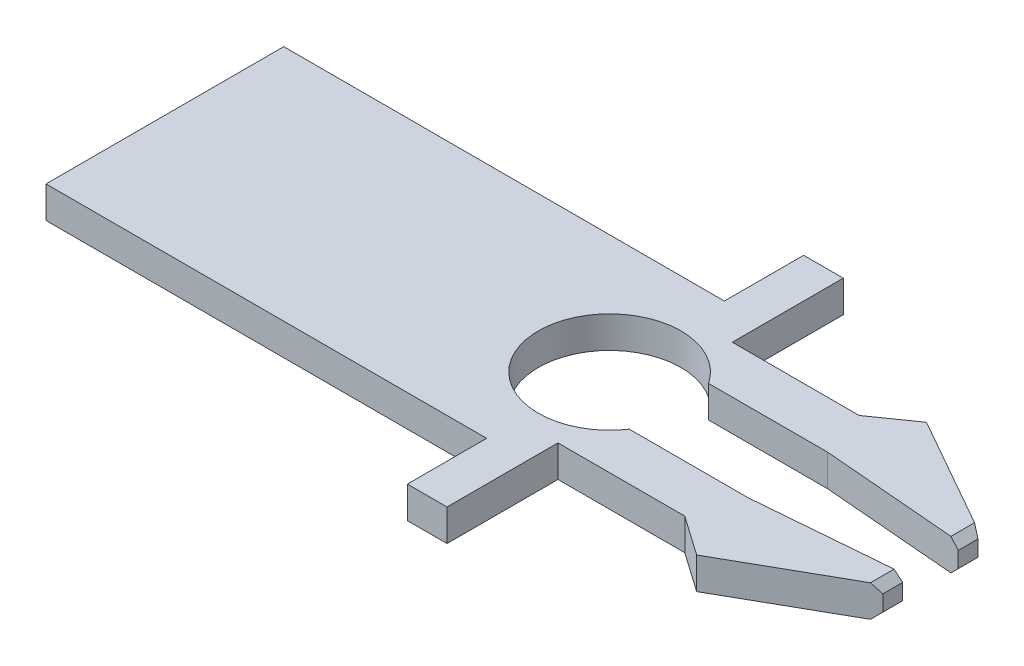
ISO-10303-21;
HEADER;
FILE_DESCRIPTION(('STEP AP214'),'2;1');
FILE_NAME('part.step','',(''),(''),'','','');
FILE_SCHEMA(('AUTOMOTIVE_DESIGN { 1 0 10303 214 1 1 1 1 }'));
ENDSEC;
DATA;
#1=APPLICATION_CONTEXT('core data for automotive mechanical design processes');
#2=APPLICATION_PROTOCOL_DEFINITION('international standard','automotive_design',2000,#1);
#3=PRODUCT_CONTEXT('',#1,'mechanical');
#4=PRODUCT('Part','Part','',(#3));
#5=PRODUCT_RELATED_PRODUCT_CATEGORY('part','',(#4));
#6=PRODUCT_DEFINITION_FORMATION('','',#4);
#7=PRODUCT_DEFINITION_CONTEXT('part definition',#1,'design');
#8=PRODUCT_DEFINITION('design','',#6,#7);
#9=PRODUCT_DEFINITION_SHAPE('','',#8);
#10=(LENGTH_UNIT() NAMED_UNIT(*) SI_UNIT(.MILLI.,.METRE.));
#11=(NAMED_UNIT(*) PLANE_ANGLE_UNIT() SI_UNIT($,.RADIAN.));
#12=(NAMED_UNIT(*) SI_UNIT($,.STERADIAN.) SOLID_ANGLE_UNIT());
#13=UNCERTAINTY_MEASURE_WITH_UNIT(LENGTH_MEASURE(1.E-05),#10,'distance_accuracy_value','');
#14=(GEOMETRIC_REPRESENTATION_CONTEXT(3) GLOBAL_UNCERTAINTY_ASSIGNED_CONTEXT((#13)) GLOBAL_UNIT_ASSIGNED_CONTEXT((#10,
#11,#12)) REPRESENTATION_CONTEXT('',''));
#15=CARTESIAN_POINT('',(0.,0.,0.));
#16=DIRECTION('',(0.,0.,1.));
#17=DIRECTION('',(1.,0.,0.));
#18=AXIS2_PLACEMENT_3D('',#15,#16,#17);
#19=CARTESIAN_POINT('',(7.03,18.74,0.95));
#20=DIRECTION('',(-0.707106781186547,-0.707106781186548,0.));
#21=DIRECTION('',(0.,0.,-1.));
#22=AXIS2_PLACEMENT_3D('',#19,#20,#21);
#23=PLANE('',#22);
#24=DIRECTION('',(0.705882352941177,-0.705882352941176,-0.0588235294117651));
#25=VECTOR('',#24,1.);
#26=CARTESIAN_POINT('',(6.98017301038062,18.7898269896194,0.704152249134948));
#27=LINE('',#26,#25);
#28=CARTESIAN_POINT('',(6.93,18.84,0.708333333333333));
#29=VERTEX_POINT('',#28);
#30=CARTESIAN_POINT('',(7.03,18.74,0.7));
#31=VERTEX_POINT('',#30);
#32=EDGE_CURVE('E407',#29,#31,#27,.T.);
#33=ORIENTED_EDGE('',*,*,#32,.F.);
#34=DIRECTION('',(0.,0.,-1.));
#35=VECTOR('',#34,1.);
#36=CARTESIAN_POINT('',(6.93,18.84,0.35));
#37=LINE('',#36,#35);
#38=CARTESIAN_POINT('',(6.93,18.84,1.00666666666667));
#39=VERTEX_POINT('',#38);
#40=EDGE_CURVE('E419',#39,#29,#37,.T.);
#41=ORIENTED_EDGE('',*,*,#40,.F.);
#42=DIRECTION('',(-0.656375005190605,0.656375005190604,0.371945836274676));
#43=VECTOR('',#42,1.);
#44=CARTESIAN_POINT('',(6.13315940641455,19.6368405935855,1.45820966969842));
#45=LINE('',#44,#43);
#46=CARTESIAN_POINT('',(7.03,18.74,0.95));
#47=VERTEX_POINT('',#46);
#48=EDGE_CURVE('E320',#47,#39,#45,.T.);
#49=ORIENTED_EDGE('',*,*,#48,.F.);
#50=DIRECTION('',(0.,0.,1.));
#51=VECTOR('',#50,1.);
#52=CARTESIAN_POINT('',(7.03,18.74,0.95));
#53=LINE('',#52,#51);
#54=EDGE_CURVE('E310',#31,#47,#53,.T.);
#55=ORIENTED_EDGE('',*,*,#54,.F.);
#56=EDGE_LOOP('',(#33,#41,#49,#55));
#57=FACE_BOUND('',#56,.T.);
#58=ADVANCED_FACE('F16',(#57),#23,.F.);
#59=CARTESIAN_POINT('',(7.03,18.74,-0.25));
#60=DIRECTION('',(-0.707106781186547,-0.707106781186548,0.));
#61=DIRECTION('',(0.,0.,-1.));
#62=AXIS2_PLACEMENT_3D('',#59,#60,#61);
#63=PLANE('',#62);
#64=DIRECTION('',(0.656375005190605,-0.656375005190604,0.371945836274676));
#65=VECTOR('',#64,1.);
#66=CARTESIAN_POINT('',(6.13315940641455,19.6368405935855,-0.75820966969842));
#67=LINE('',#66,#65);
#68=CARTESIAN_POINT('',(6.93,18.84,-0.306666666666666));
#69=VERTEX_POINT('',#68);
#70=CARTESIAN_POINT('',(7.03,18.74,-0.25));
#71=VERTEX_POINT('',#70);
#72=EDGE_CURVE('E242',#69,#71,#67,.T.);
#73=ORIENTED_EDGE('',*,*,#72,.F.);
#74=DIRECTION('',(0.,0.,-1.));
#75=VECTOR('',#74,1.);
#76=CARTESIAN_POINT('',(6.93,18.84,0.35));
#77=LINE('',#76,#75);
#78=CARTESIAN_POINT('',(6.93,18.84,-0.00833333333333303));
#79=VERTEX_POINT('',#78);
#80=EDGE_CURVE('E308',#79,#69,#77,.T.);
#81=ORIENTED_EDGE('',*,*,#80,.F.);
#82=DIRECTION('',(-0.705882352941177,0.705882352941176,-0.0588235294117651));
#83=VECTOR('',#82,1.);
#84=CARTESIAN_POINT('',(6.98017301038062,18.7898269896194,-0.00415224913494805));
#85=LINE('',#84,#83);
#86=CARTESIAN_POINT('',(7.03,18.74,0.));
#87=VERTEX_POINT('',#86);
#88=EDGE_CURVE('E245',#87,#79,#85,.T.);
#89=ORIENTED_EDGE('',*,*,#88,.F.);
#90=DIRECTION('',(0.,0.,1.));
#91=VECTOR('',#90,1.);
#92=CARTESIAN_POINT('',(7.03,18.74,-0.25));
#93=LINE('',#92,#91);
#94=EDGE_CURVE('E238',#71,#87,#93,.T.);
#95=ORIENTED_EDGE('',*,*,#94,.F.);
#96=EDGE_LOOP('',(#73,#81,#89,#95));
#97=FACE_BOUND('',#96,.T.);
#98=ADVANCED_FACE('F240',(#97),#63,.F.);
#99=CARTESIAN_POINT('',(6.93,18.44,0.35));
#100=DIRECTION('',(0.707106781186547,-0.707106781186548,0.));
#101=DIRECTION('',(0.,0.,-1.));
#102=AXIS2_PLACEMENT_3D('',#99,#100,#101);
#103=PLANE('',#102);
#104=DIRECTION('',(-0.705882352941177,-0.705882352941176,0.0588235294117651));
#105=VECTOR('',#104,1.);
#106=CARTESIAN_POINT('',(7.17948096885813,18.6894809688582,0.687543252595155));
#107=LINE('',#106,#105);
#108=CARTESIAN_POINT('',(7.03,18.54,0.7));
#109=VERTEX_POINT('',#108);
#110=CARTESIAN_POINT('',(6.93,18.44,0.708333333333333));
#111=VERTEX_POINT('',#110);
#112=EDGE_CURVE('E294',#109,#111,#107,.T.);
#113=ORIENTED_EDGE('',*,*,#112,.F.);
#114=DIRECTION('',(0.,0.,-1.));
#115=VECTOR('',#114,1.);
#116=CARTESIAN_POINT('',(7.03,18.54,0.7));
#117=LINE('',#116,#115);
#118=CARTESIAN_POINT('',(7.03,18.54,0.95));
#119=VERTEX_POINT('',#118);
#120=EDGE_CURVE('E315',#119,#109,#117,.T.);
#121=ORIENTED_EDGE('',*,*,#120,.F.);
#122=DIRECTION('',(0.656375005190605,0.656375005190604,-0.371945836274676));
#123=VECTOR('',#122,1.);
#124=CARTESIAN_POINT('',(6.30549066539014,17.8154906653902,1.36055528961226));
#125=LINE('',#124,#123);
#126=CARTESIAN_POINT('',(6.93,18.44,1.00666666666667));
#127=VERTEX_POINT('',#126);
#128=EDGE_CURVE('E331',#127,#119,#125,.T.);
#129=ORIENTED_EDGE('',*,*,#128,.F.);
#130=DIRECTION('',(0.,0.,1.));
#131=VECTOR('',#130,1.);
#132=CARTESIAN_POINT('',(6.93,18.44,0.95));
#133=LINE('',#132,#131);
#134=EDGE_CURVE('E11',#111,#127,#133,.T.);
#135=ORIENTED_EDGE('',*,*,#134,.F.);
#136=EDGE_LOOP('',(#113,#121,#129,#135));
#137=FACE_BOUND('',#136,.T.);
#138=ADVANCED_FACE('F574',(#137),#103,.T.);
#139=CARTESIAN_POINT('',(6.93,18.44,0.35));
#140=DIRECTION('',(0.707106781186547,-0.707106781186548,0.));
#141=DIRECTION('',(0.,0.,-1.));
#142=AXIS2_PLACEMENT_3D('',#139,#140,#141);
#143=PLANE('',#142);
#144=DIRECTION('',(-0.656375005190605,-0.656375005190604,-0.371945836274676));
#145=VECTOR('',#144,1.);
#146=CARTESIAN_POINT('',(6.30549066539014,17.8154906653902,-0.66055528961226));
#147=LINE('',#146,#145);
#148=CARTESIAN_POINT('',(7.03,18.54,-0.25));
#149=VERTEX_POINT('',#148);
#150=CARTESIAN_POINT('',(6.93,18.44,-0.306666666666666));
#151=VERTEX_POINT('',#150);
#152=EDGE_CURVE('E268',#149,#151,#147,.T.);
#153=ORIENTED_EDGE('',*,*,#152,.F.);
#154=DIRECTION('',(0.,0.,-1.));
#155=VECTOR('',#154,1.);
#156=CARTESIAN_POINT('',(7.03,18.54,-0.25));
#157=LINE('',#156,#155);
#158=CARTESIAN_POINT('',(7.03,18.54,0.));
#159=VERTEX_POINT('',#158);
#160=EDGE_CURVE('E252',#159,#149,#157,.T.);
#161=ORIENTED_EDGE('',*,*,#160,.F.);
#162=DIRECTION('',(0.705882352941177,0.705882352941176,0.0588235294117651));
#163=VECTOR('',#162,1.);
#164=CARTESIAN_POINT('',(7.17948096885813,18.6894809688582,0.012456747404845));
#165=LINE('',#164,#163);
#166=CARTESIAN_POINT('',(6.93,18.44,-0.00833333333333303));
#167=VERTEX_POINT('',#166);
#168=EDGE_CURVE('E350',#167,#159,#165,.T.);
#169=ORIENTED_EDGE('',*,*,#168,.F.);
#170=DIRECTION('',(0.,0.,1.));
#171=VECTOR('',#170,1.);
#172=CARTESIAN_POINT('',(6.93,18.44,0.));
#173=LINE('',#172,#171);
#174=EDGE_CURVE('E27',#151,#167,#173,.T.);
#175=ORIENTED_EDGE('',*,*,#174,.F.);
#176=EDGE_LOOP('',(#153,#161,#169,#175));
#177=FACE_BOUND('',#176,.T.);
#178=ADVANCED_FACE('F621',(#177),#143,.T.);
#179=CARTESIAN_POINT('',(2.98166852264522,18.44,0.35));
#180=DIRECTION('',(0.,1.,0.));
#181=DIRECTION('',(-1.,0.,0.));
#182=AXIS2_PLACEMENT_3D('',#179,#180,#181);
#183=PLANE('',#182);
#184=DIRECTION('',(0.870022185848613,0.,0.49301257198088));
#185=VECTOR('',#184,1.);
#186=CARTESIAN_POINT('',(5.53,18.44,-1.1));
#187=LINE('',#186,#185);
#188=CARTESIAN_POINT('',(5.53,18.44,-1.1));
#189=VERTEX_POINT('',#188);
#190=EDGE_CURVE('E275',#189,#151,#187,.T.);
#191=ORIENTED_EDGE('',*,*,#190,.T.);
#192=ORIENTED_EDGE('',*,*,#174,.T.);
#193=DIRECTION('',(-0.99654575824488,0.,-0.0830454798537404));
#194=VECTOR('',#193,1.);
#195=CARTESIAN_POINT('',(7.03,18.44,0.));
#196=LINE('',#195,#194);
#197=CARTESIAN_POINT('',(5.23,18.44,-0.15));
#198=VERTEX_POINT('',#197);
#199=EDGE_CURVE('E251',#167,#198,#196,.T.);
#200=ORIENTED_EDGE('',*,*,#199,.T.);
#201=DIRECTION('',(-1.,0.,0.));
#202=VECTOR('',#201,1.);
#203=CARTESIAN_POINT('',(5.23,18.44,-0.15));
#204=LINE('',#203,#202);
#205=CARTESIAN_POINT('',(3.73,18.44,-0.15));
#206=VERTEX_POINT('',#205);
#207=EDGE_CURVE('E287',#198,#206,#204,.T.);
#208=ORIENTED_EDGE('',*,*,#207,.T.);
#209=CARTESIAN_POINT('',(2.98166852264522,18.44,0.35));
#210=DIRECTION('',(0.,1.,0.));
#211=DIRECTION('',(1.,0.,0.));
#212=AXIS2_PLACEMENT_3D('',#209,#210,#211);
#213=CIRCLE('',#212,0.9);
#214=CARTESIAN_POINT('',(3.73,18.44,0.85));
#215=VERTEX_POINT('',#214);
#216=EDGE_CURVE('E283',#206,#215,#213,.T.);
#217=ORIENTED_EDGE('',*,*,#216,.T.);
#218=DIRECTION('',(1.,0.,0.));
#219=VECTOR('',#218,1.);
#220=CARTESIAN_POINT('',(5.23,18.44,0.85));
#221=LINE('',#220,#219);
#222=CARTESIAN_POINT('',(5.23,18.44,0.85));
#223=VERTEX_POINT('',#222);
#224=EDGE_CURVE('E344',#215,#223,#221,.T.);
#225=ORIENTED_EDGE('',*,*,#224,.T.);
#226=DIRECTION('',(0.99654575824488,0.,-0.0830454798537404));
#227=VECTOR('',#226,1.);
#228=CARTESIAN_POINT('',(7.03,18.44,0.7));
#229=LINE('',#228,#227);
#230=EDGE_CURVE('E289',#223,#111,#229,.T.);
#231=ORIENTED_EDGE('',*,*,#230,.T.);
#232=ORIENTED_EDGE('',*,*,#134,.T.);
#233=DIRECTION('',(-0.870022185848613,0.,0.49301257198088));
#234=VECTOR('',#233,1.);
#235=CARTESIAN_POINT('',(5.53,18.44,1.8));
#236=LINE('',#235,#234);
#237=CARTESIAN_POINT('',(5.53,18.44,1.8));
#238=VERTEX_POINT('',#237);
#239=EDGE_CURVE('E314',#127,#238,#236,.T.);
#240=ORIENTED_EDGE('',*,*,#239,.T.);
#241=DIRECTION('',(-0.81923192051904,0.,-0.573462344363329));
#242=VECTOR('',#241,1.);
#243=CARTESIAN_POINT('',(5.03,18.44,1.45));
#244=LINE('',#243,#242);
#245=CARTESIAN_POINT('',(5.03,18.44,1.45));
#246=VERTEX_POINT('',#245);
#247=EDGE_CURVE('E326',#238,#246,#244,.T.);
#248=ORIENTED_EDGE('',*,*,#247,.T.);
#249=DIRECTION('',(-1.,0.,0.));
#250=VECTOR('',#249,1.);
#251=CARTESIAN_POINT('',(3.43,18.44,1.45));
#252=LINE('',#251,#250);
#253=CARTESIAN_POINT('',(3.43,18.44,1.45));
#254=VERTEX_POINT('',#253);
#255=EDGE_CURVE('E379',#246,#254,#252,.T.);
#256=ORIENTED_EDGE('',*,*,#255,.T.);
#257=DIRECTION('',(0.,0.,1.));
#258=VECTOR('',#257,1.);
#259=CARTESIAN_POINT('',(3.43,18.44,2.85));
#260=LINE('',#259,#258);
#261=CARTESIAN_POINT('',(3.43,18.44,2.85));
#262=VERTEX_POINT('',#261);
#263=EDGE_CURVE('E300',#254,#262,#260,.T.);
#264=ORIENTED_EDGE('',*,*,#263,.T.);
#265=DIRECTION('',(-1.,0.,0.));
#266=VECTOR('',#265,1.);
#267=CARTESIAN_POINT('',(2.93,18.44,2.85));
#268=LINE('',#267,#266);
#269=CARTESIAN_POINT('',(2.93,18.44,2.85));
#270=VERTEX_POINT('',#269);
#271=EDGE_CURVE('E366',#262,#270,#268,.T.);
#272=ORIENTED_EDGE('',*,*,#271,.T.);
#273=DIRECTION('',(0.,0.,-1.));
#274=VECTOR('',#273,1.);
#275=CARTESIAN_POINT('',(2.93,18.44,1.85));
#276=LINE('',#275,#274);
#277=CARTESIAN_POINT('',(2.93,18.44,1.85));
#278=VERTEX_POINT('',#277);
#279=EDGE_CURVE('E467',#270,#278,#276,.T.);
#280=ORIENTED_EDGE('',*,*,#279,.T.);
#281=DIRECTION('',(-1.,0.,0.));
#282=VECTOR('',#281,1.);
#283=CARTESIAN_POINT('',(-2.63,18.44,1.85));
#284=LINE('',#283,#282);
#285=CARTESIAN_POINT('',(-2.63,18.44,1.85));
#286=VERTEX_POINT('',#285);
#287=EDGE_CURVE('E309',#278,#286,#284,.T.);
#288=ORIENTED_EDGE('',*,*,#287,.T.);
#289=DIRECTION('',(0.,0.,-1.));
#290=VECTOR('',#289,1.);
#291=CARTESIAN_POINT('',(-2.63,18.44,-1.15));
#292=LINE('',#291,#290);
#293=CARTESIAN_POINT('',(-2.63,18.44,-1.15));
#294=VERTEX_POINT('',#293);
#295=EDGE_CURVE('E352',#286,#294,#292,.T.);
#296=ORIENTED_EDGE('',*,*,#295,.T.);
#297=DIRECTION('',(1.,0.,0.));
#298=VECTOR('',#297,1.);
#299=CARTESIAN_POINT('',(-2.63,18.44,-1.15));
#300=LINE('',#299,#298);
#301=CARTESIAN_POINT('',(2.93,18.44,-1.15));
#302=VERTEX_POINT('',#301);
#303=EDGE_CURVE('E495',#294,#302,#300,.T.);
#304=ORIENTED_EDGE('',*,*,#303,.T.);
#305=DIRECTION('',(0.,0.,-1.));
#306=VECTOR('',#305,1.);
#307=CARTESIAN_POINT('',(2.93,18.44,-1.15));
#308=LINE('',#307,#306);
#309=CARTESIAN_POINT('',(2.93,18.44,-2.15));
#310=VERTEX_POINT('',#309);
#311=EDGE_CURVE('E389',#302,#310,#308,.T.);
#312=ORIENTED_EDGE('',*,*,#311,.T.);
#313=DIRECTION('',(1.,0.,0.));
#314=VECTOR('',#313,1.);
#315=CARTESIAN_POINT('',(2.93,18.44,-2.15));
#316=LINE('',#315,#314);
#317=CARTESIAN_POINT('',(3.43,18.44,-2.15));
#318=VERTEX_POINT('',#317);
#319=EDGE_CURVE('E399',#310,#318,#316,.T.);
#320=ORIENTED_EDGE('',*,*,#319,.T.);
#321=DIRECTION('',(0.,0.,1.));
#322=VECTOR('',#321,1.);
#323=CARTESIAN_POINT('',(3.43,18.44,-2.15));
#324=LINE('',#323,#322);
#325=CARTESIAN_POINT('',(3.43,18.44,-0.75));
#326=VERTEX_POINT('',#325);
#327=EDGE_CURVE('E423',#318,#326,#324,.T.);
#328=ORIENTED_EDGE('',*,*,#327,.T.);
#329=DIRECTION('',(1.,0.,0.));
#330=VECTOR('',#329,1.);
#331=CARTESIAN_POINT('',(3.43,18.44,-0.75));
#332=LINE('',#331,#330);
#333=CARTESIAN_POINT('',(5.03,18.44,-0.75));
#334=VERTEX_POINT('',#333);
#335=EDGE_CURVE('E371',#326,#334,#332,.T.);
#336=ORIENTED_EDGE('',*,*,#335,.T.);
#337=DIRECTION('',(0.81923192051904,0.,-0.573462344363329));
#338=VECTOR('',#337,1.);
#339=CARTESIAN_POINT('',(5.03,18.44,-0.75));
#340=LINE('',#339,#338);
#341=EDGE_CURVE('E295',#334,#189,#340,.T.);
#342=ORIENTED_EDGE('',*,*,#341,.T.);
#343=EDGE_LOOP('',(#191,#192,#200,#208,#217,#225,#231,#232,#240,#248,#256,#264,#272,#280,#288,
#296,#304,#312,#320,#328,#336,#342));
#344=FACE_BOUND('',#343,.T.);
#345=ADVANCED_FACE('F548',(#344),#183,.F.);
#346=CARTESIAN_POINT('',(2.98166852264522,18.84,0.35));
#347=DIRECTION('',(0.,1.,0.));
#348=DIRECTION('',(-1.,0.,0.));
#349=AXIS2_PLACEMENT_3D('',#346,#347,#348);
#350=PLANE('',#349);
#351=DIRECTION('',(-0.99654575824488,0.,-0.0830454798537404));
#352=VECTOR('',#351,1.);
#353=CARTESIAN_POINT('',(7.03,18.84,0.));
#354=LINE('',#353,#352);
#355=CARTESIAN_POINT('',(5.23,18.84,-0.15));
#356=VERTEX_POINT('',#355);
#357=EDGE_CURVE('E288',#79,#356,#354,.T.);
#358=ORIENTED_EDGE('',*,*,#357,.F.);
#359=ORIENTED_EDGE('',*,*,#80,.T.);
#360=DIRECTION('',(0.870022185848613,0.,0.49301257198088));
#361=VECTOR('',#360,1.);
#362=CARTESIAN_POINT('',(5.53,18.84,-1.1));
#363=LINE('',#362,#361);
#364=CARTESIAN_POINT('',(5.53,18.84,-1.1));
#365=VERTEX_POINT('',#364);
#366=EDGE_CURVE('E260',#365,#69,#363,.T.);
#367=ORIENTED_EDGE('',*,*,#366,.F.);
#368=DIRECTION('',(0.81923192051904,0.,-0.573462344363329));
#369=VECTOR('',#368,1.);
#370=CARTESIAN_POINT('',(5.03,18.84,-0.75));
#371=LINE('',#370,#369);
#372=CARTESIAN_POINT('',(5.03,18.84,-0.75));
#373=VERTEX_POINT('',#372);
#374=EDGE_CURVE('E279',#373,#365,#371,.T.);
#375=ORIENTED_EDGE('',*,*,#374,.F.);
#376=DIRECTION('',(1.,0.,0.));
#377=VECTOR('',#376,1.);
#378=CARTESIAN_POINT('',(3.43,18.84,-0.75));
#379=LINE('',#378,#377);
#380=CARTESIAN_POINT('',(3.43,18.84,-0.75));
#381=VERTEX_POINT('',#380);
#382=EDGE_CURVE('E330',#381,#373,#379,.T.);
#383=ORIENTED_EDGE('',*,*,#382,.F.);
#384=DIRECTION('',(0.,0.,1.));
#385=VECTOR('',#384,1.);
#386=CARTESIAN_POINT('',(3.43,18.84,-2.15));
#387=LINE('',#386,#385);
#388=CARTESIAN_POINT('',(3.43,18.84,-2.15));
#389=VERTEX_POINT('',#388);
#390=EDGE_CURVE('E372',#389,#381,#387,.T.);
#391=ORIENTED_EDGE('',*,*,#390,.F.);
#392=DIRECTION('',(1.,0.,0.));
#393=VECTOR('',#392,1.);
#394=CARTESIAN_POINT('',(2.93,18.84,-2.15));
#395=LINE('',#394,#393);
#396=CARTESIAN_POINT('',(2.93,18.84,-2.15));
#397=VERTEX_POINT('',#396);
#398=EDGE_CURVE('E408',#397,#389,#395,.T.);
#399=ORIENTED_EDGE('',*,*,#398,.F.);
#400=DIRECTION('',(0.,0.,-1.));
#401=VECTOR('',#400,1.);
#402=CARTESIAN_POINT('',(2.93,18.84,-1.15));
#403=LINE('',#402,#401);
#404=CARTESIAN_POINT('',(2.93,18.84,-1.15));
#405=VERTEX_POINT('',#404);
#406=EDGE_CURVE('E393',#405,#397,#403,.T.);
#407=ORIENTED_EDGE('',*,*,#406,.F.);
#408=DIRECTION('',(1.,0.,0.));
#409=VECTOR('',#408,1.);
#410=CARTESIAN_POINT('',(-2.63,18.84,-1.15));
#411=LINE('',#410,#409);
#412=CARTESIAN_POINT('',(-2.63,18.84,-1.15));
#413=VERTEX_POINT('',#412);
#414=EDGE_CURVE('E506',#413,#405,#411,.T.);
#415=ORIENTED_EDGE('',*,*,#414,.F.);
#416=DIRECTION('',(0.,0.,-1.));
#417=VECTOR('',#416,1.);
#418=CARTESIAN_POINT('',(-2.63,18.84,-1.15));
#419=LINE('',#418,#417);
#420=CARTESIAN_POINT('',(-2.63,18.84,1.85));
#421=VERTEX_POINT('',#420);
#422=EDGE_CURVE('E428',#421,#413,#419,.T.);
#423=ORIENTED_EDGE('',*,*,#422,.F.);
#424=DIRECTION('',(-1.,0.,0.));
#425=VECTOR('',#424,1.);
#426=CARTESIAN_POINT('',(-2.63,18.84,1.85));
#427=LINE('',#426,#425);
#428=CARTESIAN_POINT('',(2.93,18.84,1.85));
#429=VERTEX_POINT('',#428);
#430=EDGE_CURVE('E41',#429,#421,#427,.T.);
#431=ORIENTED_EDGE('',*,*,#430,.F.);
#432=DIRECTION('',(0.,0.,-1.));
#433=VECTOR('',#432,1.);
#434=CARTESIAN_POINT('',(2.93,18.84,1.85));
#435=LINE('',#434,#433);
#436=CARTESIAN_POINT('',(2.93,18.84,2.85));
#437=VERTEX_POINT('',#436);
#438=EDGE_CURVE('E471',#437,#429,#435,.T.);
#439=ORIENTED_EDGE('',*,*,#438,.F.);
#440=DIRECTION('',(-1.,0.,0.));
#441=VECTOR('',#440,1.);
#442=CARTESIAN_POINT('',(2.93,18.84,2.85));
#443=LINE('',#442,#441);
#444=CARTESIAN_POINT('',(3.43,18.84,2.85));
#445=VERTEX_POINT('',#444);
#446=EDGE_CURVE('E361',#445,#437,#443,.T.);
#447=ORIENTED_EDGE('',*,*,#446,.F.);
#448=DIRECTION('',(0.,0.,1.));
#449=VECTOR('',#448,1.);
#450=CARTESIAN_POINT('',(3.43,18.84,2.85));
#451=LINE('',#450,#449);
#452=CARTESIAN_POINT('',(3.43,18.84,1.45));
#453=VERTEX_POINT('',#452);
#454=EDGE_CURVE('E304',#453,#445,#451,.T.);
#455=ORIENTED_EDGE('',*,*,#454,.F.);
#456=DIRECTION('',(-1.,0.,0.));
#457=VECTOR('',#456,1.);
#458=CARTESIAN_POINT('',(3.43,18.84,1.45));
#459=LINE('',#458,#457);
#460=CARTESIAN_POINT('',(5.03,18.84,1.45));
#461=VERTEX_POINT('',#460);
#462=EDGE_CURVE('E416',#461,#453,#459,.T.);
#463=ORIENTED_EDGE('',*,*,#462,.F.);
#464=DIRECTION('',(-0.81923192051904,0.,-0.573462344363329));
#465=VECTOR('',#464,1.);
#466=CARTESIAN_POINT('',(5.03,18.84,1.45));
#467=LINE('',#466,#465);
#468=CARTESIAN_POINT('',(5.53,18.84,1.8));
#469=VERTEX_POINT('',#468);
#470=EDGE_CURVE('E321',#469,#461,#467,.T.);
#471=ORIENTED_EDGE('',*,*,#470,.F.);
#472=DIRECTION('',(-0.870022185848613,0.,0.49301257198088));
#473=VECTOR('',#472,1.);
#474=CARTESIAN_POINT('',(5.53,18.84,1.8));
#475=LINE('',#474,#473);
#476=EDGE_CURVE('E316',#39,#469,#475,.T.);
#477=ORIENTED_EDGE('',*,*,#476,.F.);
#478=ORIENTED_EDGE('',*,*,#40,.T.);
#479=DIRECTION('',(0.99654575824488,0.,-0.0830454798537404));
#480=VECTOR('',#479,1.);
#481=CARTESIAN_POINT('',(7.03,18.84,0.7));
#482=LINE('',#481,#480);
#483=CARTESIAN_POINT('',(5.23,18.84,0.85));
#484=VERTEX_POINT('',#483);
#485=EDGE_CURVE('E293',#484,#29,#482,.T.);
#486=ORIENTED_EDGE('',*,*,#485,.F.);
#487=DIRECTION('',(1.,0.,0.));
#488=VECTOR('',#487,1.);
#489=CARTESIAN_POINT('',(5.23,18.84,0.85));
#490=LINE('',#489,#488);
#491=CARTESIAN_POINT('',(3.73,18.84,0.85));
#492=VERTEX_POINT('',#491);
#493=EDGE_CURVE('E339',#492,#484,#490,.T.);
#494=ORIENTED_EDGE('',*,*,#493,.F.);
#495=CARTESIAN_POINT('',(2.98166852264522,18.84,0.35));
#496=DIRECTION('',(0.,1.,0.));
#497=DIRECTION('',(1.,0.,0.));
#498=AXIS2_PLACEMENT_3D('',#495,#496,#497);
#499=CIRCLE('',#498,0.9);
#500=CARTESIAN_POINT('',(3.73,18.84,-0.15));
#501=VERTEX_POINT('',#500);
#502=EDGE_CURVE('E516',#501,#492,#499,.T.);
#503=ORIENTED_EDGE('',*,*,#502,.F.);
#504=DIRECTION('',(-1.,0.,0.));
#505=VECTOR('',#504,1.);
#506=CARTESIAN_POINT('',(5.23,18.84,-0.15));
#507=LINE('',#506,#505);
#508=EDGE_CURVE('E360',#356,#501,#507,.T.);
#509=ORIENTED_EDGE('',*,*,#508,.F.);
#510=EDGE_LOOP('',(#358,#359,#367,#375,#383,#391,#399,#407,#415,#423,#431,#439,#447,#455,#463,
#471,#477,#478,#486,#494,#503,#509));
#511=FACE_BOUND('',#510,.T.);
#512=ADVANCED_FACE('F555',(#511),#350,.T.);
#513=CARTESIAN_POINT('',(-2.63,18.84,1.85));
#514=DIRECTION('',(0.,0.,1.));
#515=DIRECTION('',(0.,-1.,0.));
#516=AXIS2_PLACEMENT_3D('',#513,#514,#515);
#517=PLANE('',#516);
#518=ORIENTED_EDGE('',*,*,#287,.F.);
#519=DIRECTION('',(0.,-1.,0.));
#520=VECTOR('',#519,1.);
#521=CARTESIAN_POINT('',(2.93,18.84,1.85));
#522=LINE('',#521,#520);
#523=EDGE_CURVE('E382',#429,#278,#522,.T.);
#524=ORIENTED_EDGE('',*,*,#523,.F.);
#525=ORIENTED_EDGE('',*,*,#430,.T.);
#526=DIRECTION('',(0.,-1.,0.));
#527=VECTOR('',#526,1.);
#528=CARTESIAN_POINT('',(-2.63,18.84,1.85));
#529=LINE('',#528,#527);
#530=EDGE_CURVE('E356',#421,#286,#529,.T.);
#531=ORIENTED_EDGE('',*,*,#530,.T.);
#532=EDGE_LOOP('',(#518,#524,#525,#531));
#533=FACE_BOUND('',#532,.T.);
#534=ADVANCED_FACE('F597',(#533),#517,.T.);
#535=CARTESIAN_POINT('',(2.93,18.84,1.85));
#536=DIRECTION('',(-1.,0.,0.));
#537=DIRECTION('',(0.,-1.,0.));
#538=AXIS2_PLACEMENT_3D('',#535,#536,#537);
#539=PLANE('',#538);
#540=ORIENTED_EDGE('',*,*,#279,.F.);
#541=DIRECTION('',(0.,-1.,0.));
#542=VECTOR('',#541,1.);
#543=CARTESIAN_POINT('',(2.93,18.84,2.85));
#544=LINE('',#543,#542);
#545=EDGE_CURVE('E365',#437,#270,#544,.T.);
#546=ORIENTED_EDGE('',*,*,#545,.F.);
#547=ORIENTED_EDGE('',*,*,#438,.T.);
#548=ORIENTED_EDGE('',*,*,#523,.T.);
#549=EDGE_LOOP('',(#540,#546,#547,#548));
#550=FACE_BOUND('',#549,.T.);
#551=ADVANCED_FACE('F595',(#550),#539,.T.);
#552=CARTESIAN_POINT('',(2.93,18.84,2.85));
#553=DIRECTION('',(0.,0.,1.));
#554=DIRECTION('',(0.,-1.,0.));
#555=AXIS2_PLACEMENT_3D('',#552,#553,#554);
#556=PLANE('',#555);
#557=ORIENTED_EDGE('',*,*,#271,.F.);
#558=DIRECTION('',(0.,-1.,0.));
#559=VECTOR('',#558,1.);
#560=CARTESIAN_POINT('',(3.43,18.84,2.85));
#561=LINE('',#560,#559);
#562=EDGE_CURVE('E348',#445,#262,#561,.T.);
#563=ORIENTED_EDGE('',*,*,#562,.F.);
#564=ORIENTED_EDGE('',*,*,#446,.T.);
#565=ORIENTED_EDGE('',*,*,#545,.T.);
#566=EDGE_LOOP('',(#557,#563,#564,#565));
#567=FACE_BOUND('',#566,.T.);
#568=ADVANCED_FACE('F592',(#567),#556,.T.);
#569=CARTESIAN_POINT('',(3.43,18.84,2.85));
#570=DIRECTION('',(1.,0.,0.));
#571=DIRECTION('',(0.,0.,-1.));
#572=AXIS2_PLACEMENT_3D('',#569,#570,#571);
#573=PLANE('',#572);
#574=ORIENTED_EDGE('',*,*,#263,.F.);
#575=DIRECTION('',(0.,-1.,0.));
#576=VECTOR('',#575,1.);
#577=CARTESIAN_POINT('',(3.43,18.84,1.45));
#578=LINE('',#577,#576);
#579=EDGE_CURVE('E305',#453,#254,#578,.T.);
#580=ORIENTED_EDGE('',*,*,#579,.F.);
#581=ORIENTED_EDGE('',*,*,#454,.T.);
#582=ORIENTED_EDGE('',*,*,#562,.T.);
#583=EDGE_LOOP('',(#574,#580,#581,#582));
#584=FACE_BOUND('',#583,.T.);
#585=ADVANCED_FACE('F589',(#584),#573,.T.);
#586=CARTESIAN_POINT('',(3.43,18.84,1.45));
#587=DIRECTION('',(0.,0.,1.));
#588=DIRECTION('',(0.,-1.,0.));
#589=AXIS2_PLACEMENT_3D('',#586,#587,#588);
#590=PLANE('',#589);
#591=ORIENTED_EDGE('',*,*,#255,.F.);
#592=DIRECTION('',(0.,-1.,0.));
#593=VECTOR('',#592,1.);
#594=CARTESIAN_POINT('',(5.03,18.84,1.45));
#595=LINE('',#594,#593);
#596=EDGE_CURVE('E325',#461,#246,#595,.T.);
#597=ORIENTED_EDGE('',*,*,#596,.F.);
#598=ORIENTED_EDGE('',*,*,#462,.T.);
#599=ORIENTED_EDGE('',*,*,#579,.T.);
#600=EDGE_LOOP('',(#591,#597,#598,#599));
#601=FACE_BOUND('',#600,.T.);
#602=ADVANCED_FACE('F586',(#601),#590,.T.);
#603=CARTESIAN_POINT('',(5.03,18.84,1.45));
#604=DIRECTION('',(-0.573462344363329,0.,0.81923192051904));
#605=DIRECTION('',(0.,-1.,0.));
#606=AXIS2_PLACEMENT_3D('',#603,#604,#605);
#607=PLANE('',#606);
#608=ORIENTED_EDGE('',*,*,#247,.F.);
#609=DIRECTION('',(0.,-1.,0.));
#610=VECTOR('',#609,1.);
#611=CARTESIAN_POINT('',(5.53,18.84,1.8));
#612=LINE('',#611,#610);
#613=EDGE_CURVE('E20',#469,#238,#612,.T.);
#614=ORIENTED_EDGE('',*,*,#613,.F.);
#615=ORIENTED_EDGE('',*,*,#470,.T.);
#616=ORIENTED_EDGE('',*,*,#596,.T.);
#617=EDGE_LOOP('',(#608,#614,#615,#616));
#618=FACE_BOUND('',#617,.T.);
#619=ADVANCED_FACE('F18',(#618),#607,.T.);
#620=CARTESIAN_POINT('',(5.53,18.84,1.8));
#621=DIRECTION('',(0.49301257198088,0.,0.870022185848613));
#622=DIRECTION('',(0.,1.,0.));
#623=AXIS2_PLACEMENT_3D('',#620,#621,#622);
#624=PLANE('',#623);
#625=ORIENTED_EDGE('',*,*,#239,.F.);
#626=ORIENTED_EDGE('',*,*,#128,.T.);
#627=DIRECTION('',(0.,-1.,0.));
#628=VECTOR('',#627,1.);
#629=CARTESIAN_POINT('',(7.03,18.84,0.95));
#630=LINE('',#629,#628);
#631=EDGE_CURVE('E449',#47,#119,#630,.T.);
#632=ORIENTED_EDGE('',*,*,#631,.F.);
#633=ORIENTED_EDGE('',*,*,#48,.T.);
#634=ORIENTED_EDGE('',*,*,#476,.T.);
#635=ORIENTED_EDGE('',*,*,#613,.T.);
#636=EDGE_LOOP('',(#625,#626,#632,#633,#634,#635));
#637=FACE_BOUND('',#636,.T.);
#638=ADVANCED_FACE('F580',(#637),#624,.T.);
#639=CARTESIAN_POINT('',(7.03,18.84,0.95));
#640=DIRECTION('',(1.,0.,0.));
#641=DIRECTION('',(0.,0.,-1.));
#642=AXIS2_PLACEMENT_3D('',#639,#640,#641);
#643=PLANE('',#642);
#644=ORIENTED_EDGE('',*,*,#631,.T.);
#645=ORIENTED_EDGE('',*,*,#120,.T.);
#646=DIRECTION('',(0.,-1.,0.));
#647=VECTOR('',#646,1.);
#648=CARTESIAN_POINT('',(7.03,18.84,0.7));
#649=LINE('',#648,#647);
#650=EDGE_CURVE('E439',#31,#109,#649,.T.);
#651=ORIENTED_EDGE('',*,*,#650,.F.);
#652=ORIENTED_EDGE('',*,*,#54,.T.);
#653=EDGE_LOOP('',(#644,#645,#651,#652));
#654=FACE_BOUND('',#653,.T.);
#655=ADVANCED_FACE('F572',(#654),#643,.T.);
#656=CARTESIAN_POINT('',(7.03,18.84,0.7));
#657=DIRECTION('',(-0.0830454798537404,0.,-0.99654575824488));
#658=DIRECTION('',(0.,1.,0.));
#659=AXIS2_PLACEMENT_3D('',#656,#657,#658);
#660=PLANE('',#659);
#661=ORIENTED_EDGE('',*,*,#650,.T.);
#662=ORIENTED_EDGE('',*,*,#112,.T.);
#663=ORIENTED_EDGE('',*,*,#230,.F.);
#664=DIRECTION('',(0.,-1.,0.));
#665=VECTOR('',#664,1.);
#666=CARTESIAN_POINT('',(5.23,18.84,0.85));
#667=LINE('',#666,#665);
#668=EDGE_CURVE('E343',#484,#223,#667,.T.);
#669=ORIENTED_EDGE('',*,*,#668,.F.);
#670=ORIENTED_EDGE('',*,*,#485,.T.);
#671=ORIENTED_EDGE('',*,*,#32,.T.);
#672=EDGE_LOOP('',(#661,#662,#663,#669,#670,#671));
#673=FACE_BOUND('',#672,.T.);
#674=ADVANCED_FACE('F560',(#673),#660,.T.);
#675=CARTESIAN_POINT('',(5.23,18.84,0.85));
#676=DIRECTION('',(0.,0.,-1.));
#677=DIRECTION('',(1.,0.,0.));
#678=AXIS2_PLACEMENT_3D('',#675,#676,#677);
#679=PLANE('',#678);
#680=ORIENTED_EDGE('',*,*,#224,.F.);
#681=DIRECTION('',(0.,-1.,0.));
#682=VECTOR('',#681,1.);
#683=CARTESIAN_POINT('',(3.73,18.84,0.85));
#684=LINE('',#683,#682);
#685=EDGE_CURVE('E427',#492,#215,#684,.T.);
#686=ORIENTED_EDGE('',*,*,#685,.F.);
#687=ORIENTED_EDGE('',*,*,#493,.T.);
#688=ORIENTED_EDGE('',*,*,#668,.T.);
#689=EDGE_LOOP('',(#680,#686,#687,#688));
#690=FACE_BOUND('',#689,.T.);
#691=ADVANCED_FACE('F558',(#690),#679,.T.);
#692=CARTESIAN_POINT('',(2.98166852264522,18.84,0.35));
#693=DIRECTION('',(0.,-1.,0.));
#694=DIRECTION('',(1.,0.,0.));
#695=AXIS2_PLACEMENT_3D('',#692,#693,#694);
#696=CYLINDRICAL_SURFACE('',#695,0.9);
#697=ORIENTED_EDGE('',*,*,#216,.F.);
#698=DIRECTION('',(0.,-1.,0.));
#699=VECTOR('',#698,1.);
#700=CARTESIAN_POINT('',(3.73,18.84,-0.15));
#701=LINE('',#700,#699);
#702=EDGE_CURVE('E403',#501,#206,#701,.T.);
#703=ORIENTED_EDGE('',*,*,#702,.F.);
#704=ORIENTED_EDGE('',*,*,#502,.T.);
#705=ORIENTED_EDGE('',*,*,#685,.T.);
#706=EDGE_LOOP('',(#697,#703,#704,#705));
#707=FACE_BOUND('',#706,.T.);
#708=ADVANCED_FACE('F549',(#707),#696,.F.);
#709=CARTESIAN_POINT('',(5.23,18.84,-0.15));
#710=DIRECTION('',(0.,0.,1.));
#711=DIRECTION('',(0.,-1.,0.));
#712=AXIS2_PLACEMENT_3D('',#709,#710,#711);
#713=PLANE('',#712);
#714=ORIENTED_EDGE('',*,*,#207,.F.);
#715=DIRECTION('',(0.,-1.,0.));
#716=VECTOR('',#715,1.);
#717=CARTESIAN_POINT('',(5.23,18.84,-0.15));
#718=LINE('',#717,#716);
#719=EDGE_CURVE('E284',#356,#198,#718,.T.);
#720=ORIENTED_EDGE('',*,*,#719,.F.);
#721=ORIENTED_EDGE('',*,*,#508,.T.);
#722=ORIENTED_EDGE('',*,*,#702,.T.);
#723=EDGE_LOOP('',(#714,#720,#721,#722));
#724=FACE_BOUND('',#723,.T.);
#725=ADVANCED_FACE('F552',(#724),#713,.T.);
#726=CARTESIAN_POINT('',(7.03,18.84,0.));
#727=DIRECTION('',(-0.0830454798537404,0.,0.99654575824488));
#728=DIRECTION('',(0.,-1.,0.));
#729=AXIS2_PLACEMENT_3D('',#726,#727,#728);
#730=PLANE('',#729);
#731=ORIENTED_EDGE('',*,*,#199,.F.);
#732=ORIENTED_EDGE('',*,*,#168,.T.);
#733=DIRECTION('',(0.,-1.,0.));
#734=VECTOR('',#733,1.);
#735=CARTESIAN_POINT('',(7.03,18.84,0.));
#736=LINE('',#735,#734);
#737=EDGE_CURVE('E262',#87,#159,#736,.T.);
#738=ORIENTED_EDGE('',*,*,#737,.F.);
#739=ORIENTED_EDGE('',*,*,#88,.T.);
#740=ORIENTED_EDGE('',*,*,#357,.T.);
#741=ORIENTED_EDGE('',*,*,#719,.T.);
#742=EDGE_LOOP('',(#731,#732,#738,#739,#740,#741));
#743=FACE_BOUND('',#742,.T.);
#744=ADVANCED_FACE('F625',(#743),#730,.T.);
#745=CARTESIAN_POINT('',(7.03,18.84,-0.25));
#746=DIRECTION('',(1.,0.,0.));
#747=DIRECTION('',(0.,0.,-1.));
#748=AXIS2_PLACEMENT_3D('',#745,#746,#747);
#749=PLANE('',#748);
#750=ORIENTED_EDGE('',*,*,#737,.T.);
#751=ORIENTED_EDGE('',*,*,#160,.T.);
#752=DIRECTION('',(0.,-1.,0.));
#753=VECTOR('',#752,1.);
#754=CARTESIAN_POINT('',(7.03,18.84,-0.25));
#755=LINE('',#754,#753);
#756=EDGE_CURVE('E258',#71,#149,#755,.T.);
#757=ORIENTED_EDGE('',*,*,#756,.F.);
#758=ORIENTED_EDGE('',*,*,#94,.T.);
#759=EDGE_LOOP('',(#750,#751,#757,#758));
#760=FACE_BOUND('',#759,.T.);
#761=ADVANCED_FACE('F264',(#760),#749,.T.);
#762=CARTESIAN_POINT('',(5.53,18.84,-1.1));
#763=DIRECTION('',(0.49301257198088,0.,-0.870022185848613));
#764=DIRECTION('',(0.870022185848612,0.,0.49301257198088));
#765=AXIS2_PLACEMENT_3D('',#762,#763,#764);
#766=PLANE('',#765);
#767=ORIENTED_EDGE('',*,*,#756,.T.);
#768=ORIENTED_EDGE('',*,*,#152,.T.);
#769=ORIENTED_EDGE('',*,*,#190,.F.);
#770=DIRECTION('',(0.,-1.,0.));
#771=VECTOR('',#770,1.);
#772=CARTESIAN_POINT('',(5.53,18.84,-1.1));
#773=LINE('',#772,#771);
#774=EDGE_CURVE('E269',#365,#189,#773,.T.);
#775=ORIENTED_EDGE('',*,*,#774,.F.);
#776=ORIENTED_EDGE('',*,*,#366,.T.);
#777=ORIENTED_EDGE('',*,*,#72,.T.);
#778=EDGE_LOOP('',(#767,#768,#769,#775,#776,#777));
#779=FACE_BOUND('',#778,.T.);
#780=ADVANCED_FACE('F256',(#779),#766,.T.);
#781=CARTESIAN_POINT('',(5.03,18.84,-0.75));
#782=DIRECTION('',(-0.573462344363329,0.,-0.81923192051904));
#783=DIRECTION('',(0.,1.,0.));
#784=AXIS2_PLACEMENT_3D('',#781,#782,#783);
#785=PLANE('',#784);
#786=ORIENTED_EDGE('',*,*,#341,.F.);
#787=DIRECTION('',(0.,-1.,0.));
#788=VECTOR('',#787,1.);
#789=CARTESIAN_POINT('',(5.03,18.84,-0.75));
#790=LINE('',#789,#788);
#791=EDGE_CURVE('E299',#373,#334,#790,.T.);
#792=ORIENTED_EDGE('',*,*,#791,.F.);
#793=ORIENTED_EDGE('',*,*,#374,.T.);
#794=ORIENTED_EDGE('',*,*,#774,.T.);
#795=EDGE_LOOP('',(#786,#792,#793,#794));
#796=FACE_BOUND('',#795,.T.);
#797=ADVANCED_FACE('F619',(#796),#785,.T.);
#798=CARTESIAN_POINT('',(3.43,18.84,-0.75));
#799=DIRECTION('',(0.,0.,-1.));
#800=DIRECTION('',(1.,0.,0.));
#801=AXIS2_PLACEMENT_3D('',#798,#799,#800);
#802=PLANE('',#801);
#803=ORIENTED_EDGE('',*,*,#335,.F.);
#804=DIRECTION('',(0.,-1.,0.));
#805=VECTOR('',#804,1.);
#806=CARTESIAN_POINT('',(3.43,18.84,-0.75));
#807=LINE('',#806,#805);
#808=EDGE_CURVE('E367',#381,#326,#807,.T.);
#809=ORIENTED_EDGE('',*,*,#808,.F.);
#810=ORIENTED_EDGE('',*,*,#382,.T.);
#811=ORIENTED_EDGE('',*,*,#791,.T.);
#812=EDGE_LOOP('',(#803,#809,#810,#811));
#813=FACE_BOUND('',#812,.T.);
#814=ADVANCED_FACE('F616',(#813),#802,.T.);
#815=CARTESIAN_POINT('',(3.43,18.84,-2.15));
#816=DIRECTION('',(1.,0.,0.));
#817=DIRECTION('',(0.,0.,-1.));
#818=AXIS2_PLACEMENT_3D('',#815,#816,#817);
#819=PLANE('',#818);
#820=ORIENTED_EDGE('',*,*,#327,.F.);
#821=DIRECTION('',(0.,-1.,0.));
#822=VECTOR('',#821,1.);
#823=CARTESIAN_POINT('',(3.43,18.84,-2.15));
#824=LINE('',#823,#822);
#825=EDGE_CURVE('E412',#389,#318,#824,.T.);
#826=ORIENTED_EDGE('',*,*,#825,.F.);
#827=ORIENTED_EDGE('',*,*,#390,.T.);
#828=ORIENTED_EDGE('',*,*,#808,.T.);
#829=EDGE_LOOP('',(#820,#826,#827,#828));
#830=FACE_BOUND('',#829,.T.);
#831=ADVANCED_FACE('F613',(#830),#819,.T.);
#832=CARTESIAN_POINT('',(2.93,18.84,-2.15));
#833=DIRECTION('',(0.,0.,-1.));
#834=DIRECTION('',(1.,0.,0.));
#835=AXIS2_PLACEMENT_3D('',#832,#833,#834);
#836=PLANE('',#835);
#837=ORIENTED_EDGE('',*,*,#319,.F.);
#838=DIRECTION('',(0.,-1.,0.));
#839=VECTOR('',#838,1.);
#840=CARTESIAN_POINT('',(2.93,18.84,-2.15));
#841=LINE('',#840,#839);
#842=EDGE_CURVE('E395',#397,#310,#841,.T.);
#843=ORIENTED_EDGE('',*,*,#842,.F.);
#844=ORIENTED_EDGE('',*,*,#398,.T.);
#845=ORIENTED_EDGE('',*,*,#825,.T.);
#846=EDGE_LOOP('',(#837,#843,#844,#845));
#847=FACE_BOUND('',#846,.T.);
#848=ADVANCED_FACE('F610',(#847),#836,.T.);
#849=CARTESIAN_POINT('',(2.93,18.84,-1.15));
#850=DIRECTION('',(-1.,0.,0.));
#851=DIRECTION('',(0.,-1.,0.));
#852=AXIS2_PLACEMENT_3D('',#849,#850,#851);
#853=PLANE('',#852);
#854=ORIENTED_EDGE('',*,*,#311,.F.);
#855=DIRECTION('',(0.,-1.,0.));
#856=VECTOR('',#855,1.);
#857=CARTESIAN_POINT('',(2.93,18.84,-1.15));
#858=LINE('',#857,#856);
#859=EDGE_CURVE('E394',#405,#302,#858,.T.);
#860=ORIENTED_EDGE('',*,*,#859,.F.);
#861=ORIENTED_EDGE('',*,*,#406,.T.);
#862=ORIENTED_EDGE('',*,*,#842,.T.);
#863=EDGE_LOOP('',(#854,#860,#861,#862));
#864=FACE_BOUND('',#863,.T.);
#865=ADVANCED_FACE('F607',(#864),#853,.T.);
#866=CARTESIAN_POINT('',(-2.63,18.84,-1.15));
#867=DIRECTION('',(0.,0.,-1.));
#868=DIRECTION('',(1.,0.,0.));
#869=AXIS2_PLACEMENT_3D('',#866,#867,#868);
#870=PLANE('',#869);
#871=ORIENTED_EDGE('',*,*,#303,.F.);
#872=DIRECTION('',(0.,-1.,0.));
#873=VECTOR('',#872,1.);
#874=CARTESIAN_POINT('',(-2.63,18.84,-1.15));
#875=LINE('',#874,#873);
#876=EDGE_CURVE('E432',#413,#294,#875,.T.);
#877=ORIENTED_EDGE('',*,*,#876,.F.);
#878=ORIENTED_EDGE('',*,*,#414,.T.);
#879=ORIENTED_EDGE('',*,*,#859,.T.);
#880=EDGE_LOOP('',(#871,#877,#878,#879));
#881=FACE_BOUND('',#880,.T.);
#882=ADVANCED_FACE('F604',(#881),#870,.T.);
#883=CARTESIAN_POINT('',(-2.63,18.84,-1.15));
#884=DIRECTION('',(-1.,0.,0.));
#885=DIRECTION('',(0.,-1.,0.));
#886=AXIS2_PLACEMENT_3D('',#883,#884,#885);
#887=PLANE('',#886);
#888=ORIENTED_EDGE('',*,*,#295,.F.);
#889=ORIENTED_EDGE('',*,*,#530,.F.);
#890=ORIENTED_EDGE('',*,*,#422,.T.);
#891=ORIENTED_EDGE('',*,*,#876,.T.);
#892=EDGE_LOOP('',(#888,#889,#890,#891));
#893=FACE_BOUND('',#892,.T.);
#894=ADVANCED_FACE('F601',(#893),#887,.T.);
#895=CLOSED_SHELL('',(#58,#98,#138,#178,#345,#512,#534,#551,#568,#585,#602,#619,#638,#655,#674,
#691,#708,#725,#744,#761,#780,#797,#814,#831,#848,#865,#882,#894));
#896=MANIFOLD_SOLID_BREP('B1',#895);
#897=ADVANCED_BREP_SHAPE_REPRESENTATION('',(#18,#896),#14);
#898=SHAPE_DEFINITION_REPRESENTATION(#9,#897);
ENDSEC;
END-ISO-10303-21;
